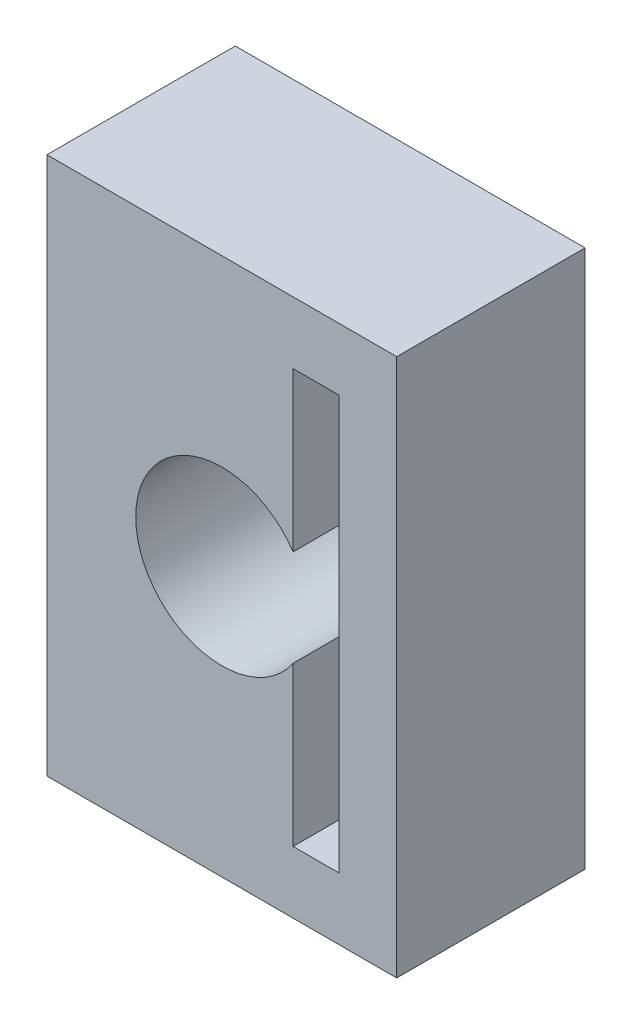
ISO-10303-21;
HEADER;
FILE_DESCRIPTION(('STEP AP214'),'2;1');
FILE_NAME('part.step','',(''),(''),'','','');
FILE_SCHEMA(('AUTOMOTIVE_DESIGN { 1 0 10303 214 1 1 1 1 }'));
ENDSEC;
DATA;
#1=APPLICATION_CONTEXT('core data for automotive mechanical design processes');
#2=APPLICATION_PROTOCOL_DEFINITION('international standard','automotive_design',2000,#1);
#3=PRODUCT_CONTEXT('',#1,'mechanical');
#4=PRODUCT('Part','Part','',(#3));
#5=PRODUCT_RELATED_PRODUCT_CATEGORY('part','',(#4));
#6=PRODUCT_DEFINITION_FORMATION('','',#4);
#7=PRODUCT_DEFINITION_CONTEXT('part definition',#1,'design');
#8=PRODUCT_DEFINITION('design','',#6,#7);
#9=PRODUCT_DEFINITION_SHAPE('','',#8);
#10=(LENGTH_UNIT() NAMED_UNIT(*) SI_UNIT(.MILLI.,.METRE.));
#11=(NAMED_UNIT(*) PLANE_ANGLE_UNIT() SI_UNIT($,.RADIAN.));
#12=(NAMED_UNIT(*) SI_UNIT($,.STERADIAN.) SOLID_ANGLE_UNIT());
#13=UNCERTAINTY_MEASURE_WITH_UNIT(LENGTH_MEASURE(1.E-05),#10,'distance_accuracy_value','');
#14=(GEOMETRIC_REPRESENTATION_CONTEXT(3) GLOBAL_UNCERTAINTY_ASSIGNED_CONTEXT((#13)) GLOBAL_UNIT_ASSIGNED_CONTEXT((#10,
#11,#12)) REPRESENTATION_CONTEXT('',''));
#15=CARTESIAN_POINT('',(0.,0.,0.));
#16=DIRECTION('',(0.,0.,1.));
#17=DIRECTION('',(1.,0.,0.));
#18=AXIS2_PLACEMENT_3D('',#15,#16,#17);
#19=CARTESIAN_POINT('',(-6.50000000000001,0.,6.));
#20=DIRECTION('',(-1.,0.,0.));
#21=DIRECTION('',(0.,0.,1.));
#22=AXIS2_PLACEMENT_3D('',#19,#20,#21);
#23=PLANE('',#22);
#24=DIRECTION('',(0.,0.,-1.));
#25=VECTOR('',#24,1.);
#26=CARTESIAN_POINT('',(-6.50000000000001,10.,6.));
#27=LINE('',#26,#25);
#28=CARTESIAN_POINT('',(-6.50000000000001,10.,6.));
#29=VERTEX_POINT('',#28);
#30=CARTESIAN_POINT('',(-6.50000000000001,10.,-1.));
#31=VERTEX_POINT('',#30);
#32=EDGE_CURVE('E61',#29,#31,#27,.T.);
#33=ORIENTED_EDGE('',*,*,#32,.T.);
#34=DIRECTION('',(0.,1.,0.));
#35=VECTOR('',#34,1.);
#36=CARTESIAN_POINT('',(-6.50000000000001,-10.,-1.));
#37=LINE('',#36,#35);
#38=CARTESIAN_POINT('',(-6.50000000000001,-10.,-1.));
#39=VERTEX_POINT('',#38);
#40=EDGE_CURVE('E155',#39,#31,#37,.T.);
#41=ORIENTED_EDGE('',*,*,#40,.F.);
#42=DIRECTION('',(0.,0.,-1.));
#43=VECTOR('',#42,1.);
#44=CARTESIAN_POINT('',(-6.50000000000001,-10.,6.));
#45=LINE('',#44,#43);
#46=CARTESIAN_POINT('',(-6.50000000000001,-10.,6.));
#47=VERTEX_POINT('',#46);
#48=EDGE_CURVE('E11',#47,#39,#45,.T.);
#49=ORIENTED_EDGE('',*,*,#48,.F.);
#50=DIRECTION('',(0.,1.,0.));
#51=VECTOR('',#50,1.);
#52=CARTESIAN_POINT('',(-6.50000000000001,0.,6.));
#53=LINE('',#52,#51);
#54=EDGE_CURVE('E167',#47,#29,#53,.T.);
#55=ORIENTED_EDGE('',*,*,#54,.T.);
#56=EDGE_LOOP('',(#33,#41,#49,#55));
#57=FACE_BOUND('',#56,.T.);
#58=ADVANCED_FACE('F38',(#57),#23,.T.);
#59=CARTESIAN_POINT('',(0.,-10.,6.));
#60=DIRECTION('',(0.,1.,0.));
#61=DIRECTION('',(0.,0.,1.));
#62=AXIS2_PLACEMENT_3D('',#59,#60,#61);
#63=PLANE('',#62);
#64=ORIENTED_EDGE('',*,*,#48,.T.);
#65=DIRECTION('',(-1.,0.,0.));
#66=VECTOR('',#65,1.);
#67=CARTESIAN_POINT('',(6.49999999999999,-10.,-1.));
#68=LINE('',#67,#66);
#69=CARTESIAN_POINT('',(6.49999999999999,-10.,-1.));
#70=VERTEX_POINT('',#69);
#71=EDGE_CURVE('E152',#70,#39,#68,.T.);
#72=ORIENTED_EDGE('',*,*,#71,.F.);
#73=DIRECTION('',(0.,0.,-1.));
#74=VECTOR('',#73,1.);
#75=CARTESIAN_POINT('',(6.49999999999999,-10.,6.));
#76=LINE('',#75,#74);
#77=CARTESIAN_POINT('',(6.49999999999999,-10.,6.));
#78=VERTEX_POINT('',#77);
#79=EDGE_CURVE('E46',#78,#70,#76,.T.);
#80=ORIENTED_EDGE('',*,*,#79,.F.);
#81=DIRECTION('',(1.,0.,0.));
#82=VECTOR('',#81,1.);
#83=CARTESIAN_POINT('',(0.,-10.,6.));
#84=LINE('',#83,#82);
#85=EDGE_CURVE('E169',#47,#78,#84,.T.);
#86=ORIENTED_EDGE('',*,*,#85,.F.);
#87=EDGE_LOOP('',(#64,#72,#80,#86));
#88=FACE_BOUND('',#87,.T.);
#89=ADVANCED_FACE('F189',(#88),#63,.F.);
#90=CARTESIAN_POINT('',(6.49999999999999,0.,6.));
#91=DIRECTION('',(-1.,0.,0.));
#92=DIRECTION('',(0.,0.,1.));
#93=AXIS2_PLACEMENT_3D('',#90,#91,#92);
#94=PLANE('',#93);
#95=ORIENTED_EDGE('',*,*,#79,.T.);
#96=DIRECTION('',(0.,-1.,0.));
#97=VECTOR('',#96,1.);
#98=CARTESIAN_POINT('',(6.49999999999999,10.,-1.));
#99=LINE('',#98,#97);
#100=CARTESIAN_POINT('',(6.49999999999999,10.,-1.));
#101=VERTEX_POINT('',#100);
#102=EDGE_CURVE('E161',#101,#70,#99,.T.);
#103=ORIENTED_EDGE('',*,*,#102,.F.);
#104=DIRECTION('',(0.,0.,-1.));
#105=VECTOR('',#104,1.);
#106=CARTESIAN_POINT('',(6.49999999999999,10.,6.));
#107=LINE('',#106,#105);
#108=CARTESIAN_POINT('',(6.49999999999999,10.,6.));
#109=VERTEX_POINT('',#108);
#110=EDGE_CURVE('E177',#109,#101,#107,.T.);
#111=ORIENTED_EDGE('',*,*,#110,.F.);
#112=DIRECTION('',(0.,1.,0.));
#113=VECTOR('',#112,1.);
#114=CARTESIAN_POINT('',(6.49999999999999,0.,6.));
#115=LINE('',#114,#113);
#116=EDGE_CURVE('E172',#78,#109,#115,.T.);
#117=ORIENTED_EDGE('',*,*,#116,.F.);
#118=EDGE_LOOP('',(#95,#103,#111,#117));
#119=FACE_BOUND('',#118,.T.);
#120=ADVANCED_FACE('F181',(#119),#94,.F.);
#121=CARTESIAN_POINT('',(0.,0.,6.));
#122=DIRECTION('',(0.,0.,-1.));
#123=DIRECTION('',(-1.,0.,0.));
#124=AXIS2_PLACEMENT_3D('',#121,#122,#123);
#125=CYLINDRICAL_SURFACE('',#124,3.2);
#126=CARTESIAN_POINT('',(0.,0.,2.));
#127=DIRECTION('',(0.,0.,-1.));
#128=DIRECTION('',(1.,0.,0.));
#129=AXIS2_PLACEMENT_3D('',#126,#127,#128);
#130=CIRCLE('',#129,3.2);
#131=CARTESIAN_POINT('',(2.65000000000399,1.79373911145931,2.));
#132=VERTEX_POINT('',#131);
#133=CARTESIAN_POINT('',(2.65000000000399,-1.79373911145931,2.));
#134=VERTEX_POINT('',#133);
#135=EDGE_CURVE('E53',#132,#134,#130,.T.);
#136=ORIENTED_EDGE('',*,*,#135,.F.);
#137=DIRECTION('',(0.,0.,-1.));
#138=VECTOR('',#137,1.);
#139=CARTESIAN_POINT('',(2.65000000000399,1.79373911145931,6.));
#140=LINE('',#139,#138);
#141=CARTESIAN_POINT('',(2.65000000000399,1.79373911145931,6.));
#142=VERTEX_POINT('',#141);
#143=EDGE_CURVE('E129',#142,#132,#140,.T.);
#144=ORIENTED_EDGE('',*,*,#143,.F.);
#145=CARTESIAN_POINT('',(0.,0.,6.));
#146=DIRECTION('',(0.,0.,1.));
#147=DIRECTION('',(1.,0.,0.));
#148=AXIS2_PLACEMENT_3D('',#145,#146,#147);
#149=CIRCLE('',#148,3.2);
#150=CARTESIAN_POINT('',(2.65000000000399,-1.79373911145931,6.));
#151=VERTEX_POINT('',#150);
#152=EDGE_CURVE('E164',#142,#151,#149,.T.);
#153=ORIENTED_EDGE('',*,*,#152,.T.);
#154=DIRECTION('',(0.,0.,-1.));
#155=VECTOR('',#154,1.);
#156=CARTESIAN_POINT('',(2.65000000000399,-1.79373911145931,6.));
#157=LINE('',#156,#155);
#158=EDGE_CURVE('E138',#134,#151,#157,.F.);
#159=ORIENTED_EDGE('',*,*,#158,.F.);
#160=EDGE_LOOP('',(#136,#144,#153,#159));
#161=FACE_BOUND('',#160,.T.);
#162=CARTESIAN_POINT('',(0.,0.,-1.));
#163=DIRECTION('',(0.,0.,-1.));
#164=DIRECTION('',(-1.,0.,0.));
#165=AXIS2_PLACEMENT_3D('',#162,#163,#164);
#166=CIRCLE('',#165,3.2);
#167=CARTESIAN_POINT('',(-3.2,0.,-1.));
#168=VERTEX_POINT('',#167);
#169=EDGE_CURVE('E149',#168,#168,#166,.T.);
#170=ORIENTED_EDGE('',*,*,#169,.T.);
#171=EDGE_LOOP('',(#170));
#172=FACE_BOUND('',#171,.T.);
#173=ADVANCED_FACE('F40',(#161,#172),#125,.F.);
#174=CARTESIAN_POINT('',(0.,10.,6.));
#175=DIRECTION('',(0.,1.,0.));
#176=DIRECTION('',(0.,0.,1.));
#177=AXIS2_PLACEMENT_3D('',#174,#175,#176);
#178=PLANE('',#177);
#179=ORIENTED_EDGE('',*,*,#110,.T.);
#180=DIRECTION('',(1.,0.,0.));
#181=VECTOR('',#180,1.);
#182=CARTESIAN_POINT('',(-6.50000000000001,10.,-1.));
#183=LINE('',#182,#181);
#184=EDGE_CURVE('E158',#31,#101,#183,.T.);
#185=ORIENTED_EDGE('',*,*,#184,.F.);
#186=ORIENTED_EDGE('',*,*,#32,.F.);
#187=DIRECTION('',(1.,0.,0.));
#188=VECTOR('',#187,1.);
#189=CARTESIAN_POINT('',(0.,10.,6.));
#190=LINE('',#189,#188);
#191=EDGE_CURVE('E174',#29,#109,#190,.T.);
#192=ORIENTED_EDGE('',*,*,#191,.T.);
#193=EDGE_LOOP('',(#179,#185,#186,#192));
#194=FACE_BOUND('',#193,.T.);
#195=ADVANCED_FACE('F193',(#194),#178,.T.);
#196=CARTESIAN_POINT('',(0.,0.,6.));
#197=DIRECTION('',(0.,0.,1.));
#198=DIRECTION('',(1.,0.,0.));
#199=AXIS2_PLACEMENT_3D('',#196,#197,#198);
#200=PLANE('',#199);
#201=DIRECTION('',(0.,-1.,0.));
#202=VECTOR('',#201,1.);
#203=CARTESIAN_POINT('',(2.65000000000399,7.69000000000008,6.));
#204=LINE('',#203,#202);
#205=CARTESIAN_POINT('',(2.65000000000399,7.69000000000008,6.));
#206=VERTEX_POINT('',#205);
#207=EDGE_CURVE('E143',#206,#142,#204,.T.);
#208=ORIENTED_EDGE('',*,*,#207,.F.);
#209=DIRECTION('',(-1.,0.,0.));
#210=VECTOR('',#209,1.);
#211=CARTESIAN_POINT('',(2.65000000000399,7.69000000000008,6.));
#212=LINE('',#211,#210);
#213=CARTESIAN_POINT('',(4.35000000000401,7.69000000000008,6.));
#214=VERTEX_POINT('',#213);
#215=EDGE_CURVE('E133',#214,#206,#212,.T.);
#216=ORIENTED_EDGE('',*,*,#215,.F.);
#217=DIRECTION('',(0.,1.,0.));
#218=VECTOR('',#217,1.);
#219=CARTESIAN_POINT('',(4.35000000000401,7.69000000000008,6.));
#220=LINE('',#219,#218);
#221=CARTESIAN_POINT('',(4.35000000000401,-7.69000000000008,6.));
#222=VERTEX_POINT('',#221);
#223=EDGE_CURVE('E232',#222,#214,#220,.T.);
#224=ORIENTED_EDGE('',*,*,#223,.F.);
#225=DIRECTION('',(1.,0.,0.));
#226=VECTOR('',#225,1.);
#227=CARTESIAN_POINT('',(2.65000000000399,-7.69000000000008,6.));
#228=LINE('',#227,#226);
#229=CARTESIAN_POINT('',(2.65000000000399,-7.69000000000008,6.));
#230=VERTEX_POINT('',#229);
#231=EDGE_CURVE('E234',#230,#222,#228,.T.);
#232=ORIENTED_EDGE('',*,*,#231,.F.);
#233=EDGE_CURVE('E230',#151,#230,#204,.T.);
#234=ORIENTED_EDGE('',*,*,#233,.F.);
#235=ORIENTED_EDGE('',*,*,#152,.F.);
#236=EDGE_LOOP('',(#208,#216,#224,#232,#234,#235));
#237=FACE_BOUND('',#236,.T.);
#238=ORIENTED_EDGE('',*,*,#54,.F.);
#239=ORIENTED_EDGE('',*,*,#85,.T.);
#240=ORIENTED_EDGE('',*,*,#116,.T.);
#241=ORIENTED_EDGE('',*,*,#191,.F.);
#242=EDGE_LOOP('',(#238,#239,#240,#241));
#243=FACE_BOUND('',#242,.T.);
#244=ADVANCED_FACE('F196',(#237,#243),#200,.T.);
#245=CARTESIAN_POINT('',(0.,0.,-1.));
#246=DIRECTION('',(0.,0.,-1.));
#247=DIRECTION('',(-1.,0.,0.));
#248=AXIS2_PLACEMENT_3D('',#245,#246,#247);
#249=PLANE('',#248);
#250=ORIENTED_EDGE('',*,*,#71,.T.);
#251=ORIENTED_EDGE('',*,*,#40,.T.);
#252=ORIENTED_EDGE('',*,*,#184,.T.);
#253=ORIENTED_EDGE('',*,*,#102,.T.);
#254=EDGE_LOOP('',(#250,#251,#252,#253));
#255=FACE_BOUND('',#254,.T.);
#256=ORIENTED_EDGE('',*,*,#169,.F.);
#257=EDGE_LOOP('',(#256));
#258=FACE_BOUND('',#257,.T.);
#259=ADVANCED_FACE('F187',(#255,#258),#249,.T.);
#260=CARTESIAN_POINT('',(2.65000000000399,7.69000000000008,-15.4736679555949));
#261=DIRECTION('',(-1.,0.,0.));
#262=DIRECTION('',(0.,0.,1.));
#263=AXIS2_PLACEMENT_3D('',#260,#261,#262);
#264=PLANE('',#263);
#265=ORIENTED_EDGE('',*,*,#143,.T.);
#266=DIRECTION('',(0.,-1.,0.));
#267=VECTOR('',#266,1.);
#268=CARTESIAN_POINT('',(2.65000000000399,7.69000000000008,2.));
#269=LINE('',#268,#267);
#270=CARTESIAN_POINT('',(2.65000000000399,7.69000000000008,2.));
#271=VERTEX_POINT('',#270);
#272=EDGE_CURVE('E116',#271,#132,#269,.T.);
#273=ORIENTED_EDGE('',*,*,#272,.F.);
#274=DIRECTION('',(0.,0.,1.));
#275=VECTOR('',#274,1.);
#276=CARTESIAN_POINT('',(2.65000000000399,7.69000000000008,-15.4736679555949));
#277=LINE('',#276,#275);
#278=EDGE_CURVE('E126',#271,#206,#277,.T.);
#279=ORIENTED_EDGE('',*,*,#278,.T.);
#280=ORIENTED_EDGE('',*,*,#207,.T.);
#281=EDGE_LOOP('',(#265,#273,#279,#280));
#282=FACE_BOUND('',#281,.T.);
#283=ADVANCED_FACE('F125',(#282),#264,.F.);
#284=CARTESIAN_POINT('',(2.65000000000399,-7.69000000000008,-15.4736679555949));
#285=DIRECTION('',(0.,-1.,0.));
#286=DIRECTION('',(0.,0.,-1.));
#287=AXIS2_PLACEMENT_3D('',#284,#285,#286);
#288=PLANE('',#287);
#289=DIRECTION('',(0.,0.,1.));
#290=VECTOR('',#289,1.);
#291=CARTESIAN_POINT('',(4.35000000000401,-7.69000000000008,-15.4736679555949));
#292=LINE('',#291,#290);
#293=CARTESIAN_POINT('',(4.35000000000401,-7.69000000000008,2.));
#294=VERTEX_POINT('',#293);
#295=EDGE_CURVE('E140',#294,#222,#292,.T.);
#296=ORIENTED_EDGE('',*,*,#295,.F.);
#297=DIRECTION('',(1.,0.,0.));
#298=VECTOR('',#297,1.);
#299=CARTESIAN_POINT('',(2.65000000000399,-7.69000000000008,2.));
#300=LINE('',#299,#298);
#301=CARTESIAN_POINT('',(2.65000000000399,-7.69000000000008,2.));
#302=VERTEX_POINT('',#301);
#303=EDGE_CURVE('E225',#302,#294,#300,.T.);
#304=ORIENTED_EDGE('',*,*,#303,.F.);
#305=DIRECTION('',(0.,0.,1.));
#306=VECTOR('',#305,1.);
#307=CARTESIAN_POINT('',(2.65000000000399,-7.69000000000008,-15.4736679555949));
#308=LINE('',#307,#306);
#309=EDGE_CURVE('E135',#302,#230,#308,.T.);
#310=ORIENTED_EDGE('',*,*,#309,.T.);
#311=ORIENTED_EDGE('',*,*,#231,.T.);
#312=EDGE_LOOP('',(#296,#304,#310,#311));
#313=FACE_BOUND('',#312,.T.);
#314=ADVANCED_FACE('F248',(#313),#288,.F.);
#315=CARTESIAN_POINT('',(4.35000000000401,7.69000000000008,-15.4736679555949));
#316=DIRECTION('',(1.,0.,0.));
#317=DIRECTION('',(0.,0.,-1.));
#318=AXIS2_PLACEMENT_3D('',#315,#316,#317);
#319=PLANE('',#318);
#320=DIRECTION('',(0.,0.,1.));
#321=VECTOR('',#320,1.);
#322=CARTESIAN_POINT('',(4.35000000000401,7.69000000000008,-15.4736679555949));
#323=LINE('',#322,#321);
#324=CARTESIAN_POINT('',(4.35000000000401,7.69000000000008,2.));
#325=VERTEX_POINT('',#324);
#326=EDGE_CURVE('E136',#325,#214,#323,.T.);
#327=ORIENTED_EDGE('',*,*,#326,.F.);
#328=DIRECTION('',(0.,1.,0.));
#329=VECTOR('',#328,1.);
#330=CARTESIAN_POINT('',(4.35000000000401,-7.69000000000008,2.));
#331=LINE('',#330,#329);
#332=EDGE_CURVE('E118',#294,#325,#331,.T.);
#333=ORIENTED_EDGE('',*,*,#332,.F.);
#334=ORIENTED_EDGE('',*,*,#295,.T.);
#335=ORIENTED_EDGE('',*,*,#223,.T.);
#336=EDGE_LOOP('',(#327,#333,#334,#335));
#337=FACE_BOUND('',#336,.T.);
#338=ADVANCED_FACE('F246',(#337),#319,.F.);
#339=CARTESIAN_POINT('',(2.65000000000399,7.69000000000008,-15.4736679555949));
#340=DIRECTION('',(0.,1.,0.));
#341=DIRECTION('',(0.,0.,1.));
#342=AXIS2_PLACEMENT_3D('',#339,#340,#341);
#343=PLANE('',#342);
#344=ORIENTED_EDGE('',*,*,#278,.F.);
#345=DIRECTION('',(-1.,0.,0.));
#346=VECTOR('',#345,1.);
#347=CARTESIAN_POINT('',(4.35000000000401,7.69000000000008,2.));
#348=LINE('',#347,#346);
#349=EDGE_CURVE('E113',#325,#271,#348,.T.);
#350=ORIENTED_EDGE('',*,*,#349,.F.);
#351=ORIENTED_EDGE('',*,*,#326,.T.);
#352=ORIENTED_EDGE('',*,*,#215,.T.);
#353=EDGE_LOOP('',(#344,#350,#351,#352));
#354=FACE_BOUND('',#353,.T.);
#355=ADVANCED_FACE('F131',(#354),#343,.F.);
#356=ORIENTED_EDGE('',*,*,#309,.F.);
#357=DIRECTION('',(0.,-1.,0.));
#358=VECTOR('',#357,1.);
#359=CARTESIAN_POINT('',(2.65000000000399,-1.79373911145931,2.));
#360=LINE('',#359,#358);
#361=EDGE_CURVE('E223',#134,#302,#360,.T.);
#362=ORIENTED_EDGE('',*,*,#361,.F.);
#363=ORIENTED_EDGE('',*,*,#158,.T.);
#364=ORIENTED_EDGE('',*,*,#233,.T.);
#365=EDGE_LOOP('',(#356,#362,#363,#364));
#366=FACE_BOUND('',#365,.T.);
#367=ADVANCED_FACE('F244',(#366),#264,.F.);
#368=CARTESIAN_POINT('',(0.,0.,2.));
#369=DIRECTION('',(0.,0.,1.));
#370=DIRECTION('',(1.,0.,0.));
#371=AXIS2_PLACEMENT_3D('',#368,#369,#370);
#372=PLANE('',#371);
#373=ORIENTED_EDGE('',*,*,#349,.T.);
#374=ORIENTED_EDGE('',*,*,#272,.T.);
#375=ORIENTED_EDGE('',*,*,#135,.T.);
#376=ORIENTED_EDGE('',*,*,#361,.T.);
#377=ORIENTED_EDGE('',*,*,#303,.T.);
#378=ORIENTED_EDGE('',*,*,#332,.T.);
#379=EDGE_LOOP('',(#373,#374,#375,#376,#377,#378));
#380=FACE_BOUND('',#379,.T.);
#381=ADVANCED_FACE('F115',(#380),#372,.T.);
#382=CLOSED_SHELL('',(#58,#89,#120,#173,#195,#244,#259,#283,#314,#338,#355,#367,#381));
#383=MANIFOLD_SOLID_BREP('B2',#382);
#384=ADVANCED_BREP_SHAPE_REPRESENTATION('',(#18,#383),#14);
#385=SHAPE_DEFINITION_REPRESENTATION(#9,#384);
ENDSEC;
END-ISO-10303-21;
